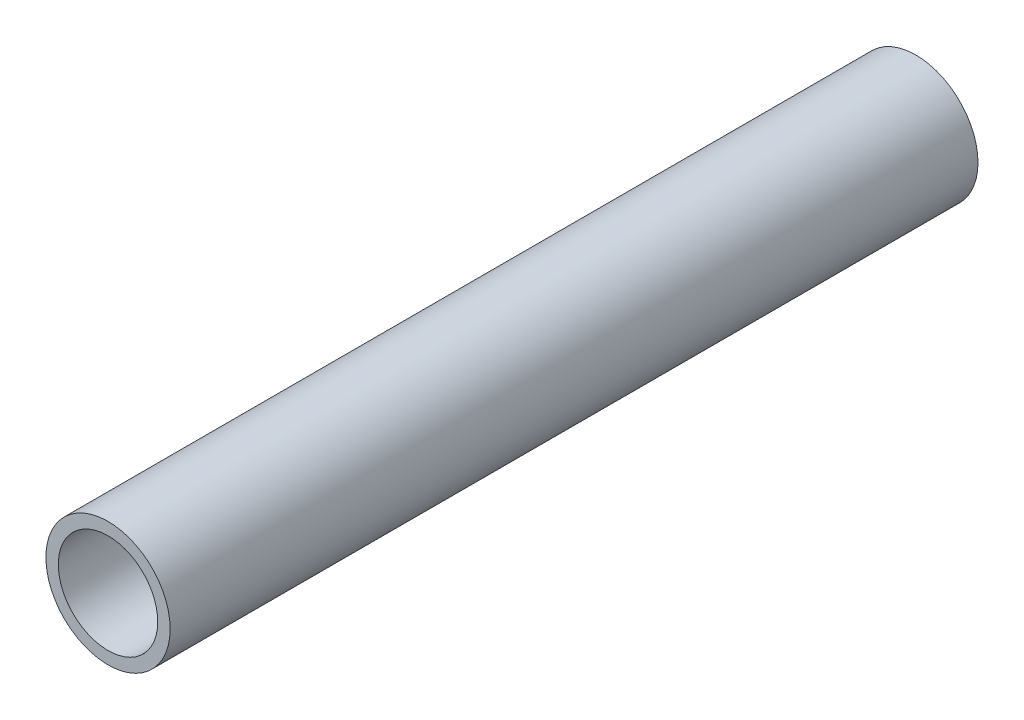
ISO-10303-21;
HEADER;
FILE_DESCRIPTION(('STEP AP214'),'2;1');
FILE_NAME('part.step','',(''),(''),'','','');
FILE_SCHEMA(('AUTOMOTIVE_DESIGN { 1 0 10303 214 1 1 1 1 }'));
ENDSEC;
DATA;
#1=APPLICATION_CONTEXT('core data for automotive mechanical design processes');
#2=APPLICATION_PROTOCOL_DEFINITION('international standard','automotive_design',2000,#1);
#3=PRODUCT_CONTEXT('',#1,'mechanical');
#4=PRODUCT('Part','Part','',(#3));
#5=PRODUCT_RELATED_PRODUCT_CATEGORY('part','',(#4));
#6=PRODUCT_DEFINITION_FORMATION('','',#4);
#7=PRODUCT_DEFINITION_CONTEXT('part definition',#1,'design');
#8=PRODUCT_DEFINITION('design','',#6,#7);
#9=PRODUCT_DEFINITION_SHAPE('','',#8);
#10=(LENGTH_UNIT() NAMED_UNIT(*) SI_UNIT(.MILLI.,.METRE.));
#11=(NAMED_UNIT(*) PLANE_ANGLE_UNIT() SI_UNIT($,.RADIAN.));
#12=(NAMED_UNIT(*) SI_UNIT($,.STERADIAN.) SOLID_ANGLE_UNIT());
#13=UNCERTAINTY_MEASURE_WITH_UNIT(LENGTH_MEASURE(1.E-05),#10,'distance_accuracy_value','');
#14=(GEOMETRIC_REPRESENTATION_CONTEXT(3) GLOBAL_UNCERTAINTY_ASSIGNED_CONTEXT((#13)) GLOBAL_UNIT_ASSIGNED_CONTEXT((#10,
#11,#12)) REPRESENTATION_CONTEXT('',''));
#15=CARTESIAN_POINT('',(0.,0.,0.));
#16=DIRECTION('',(0.,0.,1.));
#17=DIRECTION('',(1.,0.,0.));
#18=AXIS2_PLACEMENT_3D('',#15,#16,#17);
#19=CARTESIAN_POINT('',(0.,0.,32.5));
#20=DIRECTION('',(0.,0.,1.));
#21=DIRECTION('',(1.,0.,0.));
#22=AXIS2_PLACEMENT_3D('',#19,#20,#21);
#23=PLANE('',#22);
#24=CARTESIAN_POINT('',(0.,0.,32.5));
#25=DIRECTION('',(0.,0.,1.));
#26=DIRECTION('',(1.,0.,0.));
#27=AXIS2_PLACEMENT_3D('',#24,#25,#26);
#28=CIRCLE('',#27,5.);
#29=CARTESIAN_POINT('',(5.,0.,32.5));
#30=VERTEX_POINT('',#29);
#31=EDGE_CURVE('E10',#30,#30,#28,.T.);
#32=ORIENTED_EDGE('',*,*,#31,.T.);
#33=EDGE_LOOP('',(#32));
#34=FACE_BOUND('',#33,.T.);
#35=CARTESIAN_POINT('',(0.,0.,32.5));
#36=DIRECTION('',(0.,0.,1.));
#37=DIRECTION('',(1.,0.,0.));
#38=AXIS2_PLACEMENT_3D('',#35,#36,#37);
#39=CIRCLE('',#38,4.);
#40=CARTESIAN_POINT('',(4.,0.,32.5));
#41=VERTEX_POINT('',#40);
#42=EDGE_CURVE('E44',#41,#41,#39,.T.);
#43=ORIENTED_EDGE('',*,*,#42,.F.);
#44=EDGE_LOOP('',(#43));
#45=FACE_BOUND('',#44,.T.);
#46=ADVANCED_FACE('F33',(#34,#45),#23,.T.);
#47=CARTESIAN_POINT('',(0.,0.,-32.5));
#48=DIRECTION('',(0.,0.,1.));
#49=DIRECTION('',(1.,0.,0.));
#50=AXIS2_PLACEMENT_3D('',#47,#48,#49);
#51=PLANE('',#50);
#52=CARTESIAN_POINT('',(0.,0.,-32.5));
#53=DIRECTION('',(0.,0.,1.));
#54=DIRECTION('',(1.,0.,0.));
#55=AXIS2_PLACEMENT_3D('',#52,#53,#54);
#56=CIRCLE('',#55,5.);
#57=CARTESIAN_POINT('',(5.,0.,-32.5));
#58=VERTEX_POINT('',#57);
#59=EDGE_CURVE('E37',#58,#58,#56,.T.);
#60=ORIENTED_EDGE('',*,*,#59,.F.);
#61=EDGE_LOOP('',(#60));
#62=FACE_BOUND('',#61,.T.);
#63=CARTESIAN_POINT('',(0.,0.,-32.5));
#64=DIRECTION('',(0.,0.,1.));
#65=DIRECTION('',(1.,0.,0.));
#66=AXIS2_PLACEMENT_3D('',#63,#64,#65);
#67=CIRCLE('',#66,4.);
#68=CARTESIAN_POINT('',(4.,0.,-32.5));
#69=VERTEX_POINT('',#68);
#70=EDGE_CURVE('E46',#69,#69,#67,.T.);
#71=ORIENTED_EDGE('',*,*,#70,.T.);
#72=EDGE_LOOP('',(#71));
#73=FACE_BOUND('',#72,.T.);
#74=ADVANCED_FACE('F56',(#62,#73),#51,.F.);
#75=CARTESIAN_POINT('',(0.,0.,32.5));
#76=DIRECTION('',(0.,0.,-1.));
#77=DIRECTION('',(-1.,0.,0.));
#78=AXIS2_PLACEMENT_3D('',#75,#76,#77);
#79=CYLINDRICAL_SURFACE('',#78,5.);
#80=ORIENTED_EDGE('',*,*,#31,.F.);
#81=EDGE_LOOP('',(#80));
#82=FACE_BOUND('',#81,.T.);
#83=ORIENTED_EDGE('',*,*,#59,.T.);
#84=EDGE_LOOP('',(#83));
#85=FACE_BOUND('',#84,.T.);
#86=ADVANCED_FACE('F35',(#82,#85),#79,.T.);
#87=CARTESIAN_POINT('',(0.,0.,32.5));
#88=DIRECTION('',(0.,0.,-1.));
#89=DIRECTION('',(-1.,0.,0.));
#90=AXIS2_PLACEMENT_3D('',#87,#88,#89);
#91=CYLINDRICAL_SURFACE('',#90,4.);
#92=ORIENTED_EDGE('',*,*,#42,.T.);
#93=EDGE_LOOP('',(#92));
#94=FACE_BOUND('',#93,.T.);
#95=ORIENTED_EDGE('',*,*,#70,.F.);
#96=EDGE_LOOP('',(#95));
#97=FACE_BOUND('',#96,.T.);
#98=ADVANCED_FACE('F52',(#94,#97),#91,.F.);
#99=CLOSED_SHELL('',(#46,#74,#86,#98));
#100=MANIFOLD_SOLID_BREP('B2',#99);
#101=ADVANCED_BREP_SHAPE_REPRESENTATION('',(#18,#100),#14);
#102=SHAPE_DEFINITION_REPRESENTATION(#9,#101);
ENDSEC;
END-ISO-10303-21;
